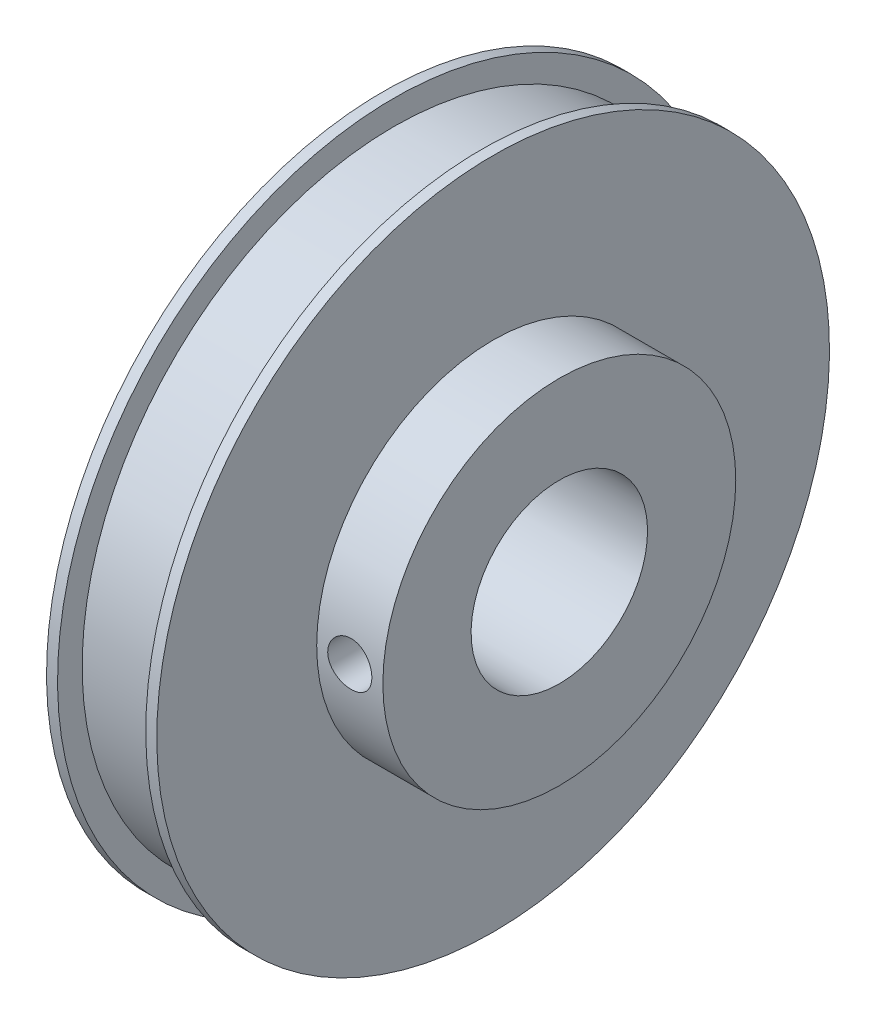
ISO-10303-21;
HEADER;
FILE_DESCRIPTION(('STEP AP214'),'2;1');
FILE_NAME('part.step','',(''),(''),'','','');
FILE_SCHEMA(('AUTOMOTIVE_DESIGN { 1 0 10303 214 1 1 1 1 }'));
ENDSEC;
DATA;
#1=APPLICATION_CONTEXT('core data for automotive mechanical design processes');
#2=APPLICATION_PROTOCOL_DEFINITION('international standard','automotive_design',2000,#1);
#3=PRODUCT_CONTEXT('',#1,'mechanical');
#4=PRODUCT('Part','Part','',(#3));
#5=PRODUCT_RELATED_PRODUCT_CATEGORY('part','',(#4));
#6=PRODUCT_DEFINITION_FORMATION('','',#4);
#7=PRODUCT_DEFINITION_CONTEXT('part definition',#1,'design');
#8=PRODUCT_DEFINITION('design','',#6,#7);
#9=PRODUCT_DEFINITION_SHAPE('','',#8);
#10=(LENGTH_UNIT() NAMED_UNIT(*) SI_UNIT(.MILLI.,.METRE.));
#11=(NAMED_UNIT(*) PLANE_ANGLE_UNIT() SI_UNIT($,.RADIAN.));
#12=(NAMED_UNIT(*) SI_UNIT($,.STERADIAN.) SOLID_ANGLE_UNIT());
#13=UNCERTAINTY_MEASURE_WITH_UNIT(LENGTH_MEASURE(1.E-05),#10,'distance_accuracy_value','');
#14=(GEOMETRIC_REPRESENTATION_CONTEXT(3) GLOBAL_UNCERTAINTY_ASSIGNED_CONTEXT((#13)) GLOBAL_UNIT_ASSIGNED_CONTEXT((#10,
#11,#12)) REPRESENTATION_CONTEXT('',''));
#15=CARTESIAN_POINT('',(0.,0.,0.));
#16=DIRECTION('',(0.,0.,1.));
#17=DIRECTION('',(1.,0.,0.));
#18=AXIS2_PLACEMENT_3D('',#15,#16,#17);
#19=CARTESIAN_POINT('',(10.0213,30.5213,30.5213));
#20=DIRECTION('',(-1.,0.,0.));
#21=DIRECTION('',(0.,-1.,0.));
#22=AXIS2_PLACEMENT_3D('',#19,#20,#21);
#23=PLANE('',#22);
#24=CARTESIAN_POINT('',(10.0213,30.5213,30.5213));
#25=DIRECTION('',(-1.,0.,0.));
#26=DIRECTION('',(0.,-1.,0.));
#27=AXIS2_PLACEMENT_3D('',#24,#25,#26);
#28=CIRCLE('',#27,16.);
#29=CARTESIAN_POINT('',(10.0213,14.5213,30.5213));
#30=VERTEX_POINT('',#29);
#31=EDGE_CURVE('E16',#30,#30,#28,.F.);
#32=ORIENTED_EDGE('',*,*,#31,.F.);
#33=EDGE_LOOP('',(#32));
#34=FACE_BOUND('',#33,.T.);
#35=CARTESIAN_POINT('',(10.0213,30.5213,30.5213));
#36=DIRECTION('',(-1.,0.,0.));
#37=DIRECTION('',(0.,-1.,0.));
#38=AXIS2_PLACEMENT_3D('',#35,#36,#37);
#39=CIRCLE('',#38,30.5);
#40=CARTESIAN_POINT('',(10.0213,0.0213000000000019,30.5213));
#41=VERTEX_POINT('',#40);
#42=EDGE_CURVE('E175',#41,#41,#39,.T.);
#43=ORIENTED_EDGE('',*,*,#42,.F.);
#44=EDGE_LOOP('',(#43));
#45=FACE_BOUND('',#44,.T.);
#46=ADVANCED_FACE('F13',(#34,#45),#23,.F.);
#47=CARTESIAN_POINT('',(16.0213,30.5213,30.5213));
#48=DIRECTION('',(-1.,0.,0.));
#49=DIRECTION('',(0.,-1.,0.));
#50=AXIS2_PLACEMENT_3D('',#47,#48,#49);
#51=CYLINDRICAL_SURFACE('',#50,16.);
#52=ORIENTED_EDGE('',*,*,#31,.T.);
#53=EDGE_LOOP('',(#52));
#54=FACE_BOUND('',#53,.T.);
#55=CARTESIAN_POINT('',(11.0213,30.5213,46.5213));
#56=CARTESIAN_POINT('',(11.0213049235413,30.6330705516784,46.5212984354949));
#57=CARTESIAN_POINT('',(11.0307085030814,30.7449875068559,46.520115527204));
#58=CARTESIAN_POINT('',(11.0680931473375,30.9657851639168,46.5155078603868));
#59=CARTESIAN_POINT('',(11.0961128346649,31.0746590620162,46.5120784412599));
#60=CARTESIAN_POINT('',(11.1698946479489,31.2860262880671,46.5033639570278));
#61=CARTESIAN_POINT('',(11.2156378087264,31.3885263008594,46.4980808760206));
#62=CARTESIAN_POINT('',(11.323529023355,31.5843472643249,46.4862480056668));
#63=CARTESIAN_POINT('',(11.3856702558448,31.6776720096713,46.4796987433355));
#64=CARTESIAN_POINT('',(11.5249718097337,31.8530678169652,46.4660227421944));
#65=CARTESIAN_POINT('',(11.6022058426999,31.9350801337535,46.4588932737014));
#66=CARTESIAN_POINT('',(11.7693457746991,32.0850189070609,46.4448821515767));
#67=CARTESIAN_POINT('',(11.859252949172,32.152943944117,46.4380005229754));
#68=CARTESIAN_POINT('',(12.04955640196,32.2729883778861,46.4252384167347));
#69=CARTESIAN_POINT('',(12.1499867701255,32.3250541286476,46.4193613659788));
#70=CARTESIAN_POINT('',(12.3582505852875,32.4115587672439,46.4093089909994));
#71=CARTESIAN_POINT('',(12.4660836866777,32.4459984773393,46.4051335873952));
#72=CARTESIAN_POINT('',(12.6854952604978,32.496099161047,46.3989827195461));
#73=CARTESIAN_POINT('',(12.7970512111634,32.5118573446681,46.3969958709405));
#74=CARTESIAN_POINT('',(13.0212408145873,32.5244484447913,46.3954122244896));
#75=CARTESIAN_POINT('',(13.133874425714,32.5212820894527,46.3958153346858));
#76=CARTESIAN_POINT('',(13.3563433727277,32.4961938465276,46.3989556360191));
#77=CARTESIAN_POINT('',(13.466191018874,32.4743792112769,46.4016794795647));
#78=CARTESIAN_POINT('',(13.6806550909836,32.412780650256,46.409133556212));
#79=CARTESIAN_POINT('',(13.7852713647753,32.3729962021122,46.4138638476399));
#80=CARTESIAN_POINT('',(13.9866384815753,32.2764705206832,46.4248131493164));
#81=CARTESIAN_POINT('',(14.0833664774452,32.2196821129028,46.4310362915393));
#82=CARTESIAN_POINT('',(14.2659523414246,32.0907992023611,46.4442662599109));
#83=CARTESIAN_POINT('',(14.3518105915254,32.0187052377157,46.4512730585034));
#84=CARTESIAN_POINT('',(14.510835983388,31.8606777794097,46.4653392746497));
#85=CARTESIAN_POINT('',(14.5839138819665,31.7746544638048,46.4723987291416));
#86=CARTESIAN_POINT('',(14.7146408785743,31.5914684210836,46.4857341880532));
#87=CARTESIAN_POINT('',(14.7722829127205,31.4943006228932,46.4920098330812));
#88=CARTESIAN_POINT('',(14.8704958920174,31.2914897311272,46.5030750061463));
#89=CARTESIAN_POINT('',(14.9110471363417,31.1858370228995,46.5078628174736));
#90=CARTESIAN_POINT('',(14.9737241824602,30.9692914963711,46.5153919682264));
#91=CARTESIAN_POINT('',(14.9958889897237,30.8584103011513,46.5181376386162));
#92=CARTESIAN_POINT('',(15.0128120286625,30.7091910695471,46.5202409685312));
#93=CARTESIAN_POINT('',(15.0159926107646,30.6716890808653,46.5206372997389));
#94=CARTESIAN_POINT('',(15.020237425861,30.5965635959675,46.5211670789556));
#95=CARTESIAN_POINT('',(15.0213016580627,30.558940099706,46.5213005268662));
#96=CARTESIAN_POINT('',(15.0212950764587,30.4095294483216,46.5212984354949));
#97=CARTESIAN_POINT('',(15.0118914969186,30.2976124931441,46.520115527204));
#98=CARTESIAN_POINT('',(14.9745068526625,30.0768148360832,46.5155078603868));
#99=CARTESIAN_POINT('',(14.946487165335,29.9679409379838,46.5120784412599));
#100=CARTESIAN_POINT('',(14.8727053520511,29.7565737119329,46.5033639570278));
#101=CARTESIAN_POINT('',(14.8269621912736,29.6540736991406,46.4980808760206));
#102=CARTESIAN_POINT('',(14.719070976645,29.4582527356751,46.4862480056668));
#103=CARTESIAN_POINT('',(14.6569297441552,29.3649279903287,46.4796987433355));
#104=CARTESIAN_POINT('',(14.5176281902663,29.1895321830348,46.4660227421944));
#105=CARTESIAN_POINT('',(14.4403941573001,29.1075198662465,46.4588932737014));
#106=CARTESIAN_POINT('',(14.2732542253009,28.9575810929391,46.4448821515767));
#107=CARTESIAN_POINT('',(14.183347050828,28.889656055883,46.4380005229754));
#108=CARTESIAN_POINT('',(13.99304359804,28.7696116221139,46.4252384167347));
#109=CARTESIAN_POINT('',(13.8926132298745,28.7175458713524,46.4193613659788));
#110=CARTESIAN_POINT('',(13.6843494147125,28.6310412327561,46.4093089909994));
#111=CARTESIAN_POINT('',(13.5765163133223,28.5966015226607,46.4051335873952));
#112=CARTESIAN_POINT('',(13.3571047395022,28.546500838953,46.3989827195461));
#113=CARTESIAN_POINT('',(13.2455487888366,28.530742655332,46.3969958709405));
#114=CARTESIAN_POINT('',(13.0213591854127,28.5181515552087,46.3954122244896));
#115=CARTESIAN_POINT('',(12.908725574286,28.5213179105473,46.3958153346858));
#116=CARTESIAN_POINT('',(12.6862566272723,28.5464061534724,46.3989556360191));
#117=CARTESIAN_POINT('',(12.576408981126,28.5682207887232,46.4016794795647));
#118=CARTESIAN_POINT('',(12.3619449090164,28.629819349744,46.409133556212));
#119=CARTESIAN_POINT('',(12.2573286352247,28.6696037978878,46.4138638476399));
#120=CARTESIAN_POINT('',(12.0559615184247,28.7661294793168,46.4248131493164));
#121=CARTESIAN_POINT('',(11.9592335225548,28.8229178870972,46.4310362915393));
#122=CARTESIAN_POINT('',(11.7766476585754,28.9518007976389,46.4442662599109));
#123=CARTESIAN_POINT('',(11.6907894084746,29.0238947622843,46.4512730585034));
#124=CARTESIAN_POINT('',(11.531764016612,29.1819222205903,46.4653392746497));
#125=CARTESIAN_POINT('',(11.4586861180335,29.2679455361952,46.4723987291416));
#126=CARTESIAN_POINT('',(11.3279591214257,29.4511315789164,46.4857341880532));
#127=CARTESIAN_POINT('',(11.2703170872795,29.5482993771068,46.4920098330812));
#128=CARTESIAN_POINT('',(11.1721041079825,29.7511102688728,46.5030750061463));
#129=CARTESIAN_POINT('',(11.1315528636582,29.8567629771005,46.5078628174736));
#130=CARTESIAN_POINT('',(11.0688758175398,30.0733085036289,46.5153919682264));
#131=CARTESIAN_POINT('',(11.0467110102763,30.1841896988487,46.5181376386162));
#132=CARTESIAN_POINT('',(11.0297879713375,30.3334089304529,46.5202409685312));
#133=CARTESIAN_POINT('',(11.0266073892354,30.3709109191347,46.5206372997389));
#134=CARTESIAN_POINT('',(11.022362574139,30.4460364040325,46.5211670789556));
#135=CARTESIAN_POINT('',(11.0212983419373,30.483659900294,46.5213005268662));
#136=CARTESIAN_POINT('',(11.0213,30.5213,46.5213));
#137=B_SPLINE_CURVE_WITH_KNOTS('',3,(#55,#56,#57,#58,#59,#60,#61,#62,#63,#64,#65,#66,#67,#68,
#69,#70,#71,#72,#73,#74,#75,#76,#77,#78,#79,#80,#81,#82,#83,#84,#85,#86,#87,#88,#89,#90,#91,#92,
#93,#94,#95,#96,#97,#98,#99,#100,#101,#102,#103,#104,#105,#106,#107,#108,#109,#110,#111,#112,
#113,#114,#115,#116,#117,#118,#119,#120,#121,#122,#123,#124,#125,#126,#127,#128,#129,#130,#131,
#132,#133,#134,#135,#136),.UNSPECIFIED.,.T.,.F.,(4,2,2,2,2,2,2,2,2,2,2,2,2,2,2,2,2,2,2,2,2,2,2,
2,2,2,2,2,2,2,2,2,2,2,2,2,2,2,2,2,4),(0.,0.335168209437112,0.671033968778323,1.00654131979086,
1.34190932399502,1.67895812019291,2.01604086162986,2.35425147796851,2.69244631523192,
3.02887350909363,3.36528775833332,3.69978009739516,4.03428216061067,4.36972097765979,
4.705148003235,5.04283107805394,5.38066842302405,5.71889414038631,6.0564004884839,
6.16927243828347,6.28214443034274,6.61731263977985,6.95317839912107,7.2886857501336,
7.62405375433776,7.96110255053565,8.2981852919726,8.63639590831125,8.97459074557466,
9.31101793943637,9.64743218867605,9.9819245277379,10.3164265909534,10.6518654080025,
10.9872924335777,11.3249755083967,11.6628128533668,12.0010385707291,12.3385449188266,
12.4514168686262,12.5642888606855),.UNSPECIFIED.);
#138=CARTESIAN_POINT('',(11.0213,30.5213,46.5213));
#139=VERTEX_POINT('',#138);
#140=EDGE_CURVE('E178',#139,#139,#137,.T.);
#141=ORIENTED_EDGE('',*,*,#140,.T.);
#142=EDGE_LOOP('',(#141));
#143=FACE_BOUND('',#142,.T.);
#144=CARTESIAN_POINT('',(16.0213,30.5213,30.5213));
#145=DIRECTION('',(-1.,0.,0.));
#146=DIRECTION('',(0.,-1.,0.));
#147=AXIS2_PLACEMENT_3D('',#144,#145,#146);
#148=CIRCLE('',#147,16.);
#149=CARTESIAN_POINT('',(16.0213,14.5213,30.5213));
#150=VERTEX_POINT('',#149);
#151=EDGE_CURVE('E176',#150,#150,#148,.T.);
#152=ORIENTED_EDGE('',*,*,#151,.T.);
#153=EDGE_LOOP('',(#152));
#154=FACE_BOUND('',#153,.T.);
#155=ADVANCED_FACE('F148',(#54,#143,#154),#51,.T.);
#156=CARTESIAN_POINT('',(10.0213,30.5213,30.5213));
#157=DIRECTION('',(-1.,0.,0.));
#158=DIRECTION('',(0.,-1.,0.));
#159=AXIS2_PLACEMENT_3D('',#156,#157,#158);
#160=CYLINDRICAL_SURFACE('',#159,30.5);
#161=ORIENTED_EDGE('',*,*,#42,.T.);
#162=EDGE_LOOP('',(#161));
#163=FACE_BOUND('',#162,.T.);
#164=CARTESIAN_POINT('',(9.0213,30.5213,30.5213));
#165=DIRECTION('',(-1.,0.,0.));
#166=DIRECTION('',(0.,-1.,0.));
#167=AXIS2_PLACEMENT_3D('',#164,#165,#166);
#168=CIRCLE('',#167,30.5);
#169=CARTESIAN_POINT('',(9.0213,0.0213000000000019,30.5213));
#170=VERTEX_POINT('',#169);
#171=EDGE_CURVE('E185',#170,#170,#168,.T.);
#172=ORIENTED_EDGE('',*,*,#171,.F.);
#173=EDGE_LOOP('',(#172));
#174=FACE_BOUND('',#173,.T.);
#175=ADVANCED_FACE('F140',(#163,#174),#160,.T.);
#176=CARTESIAN_POINT('',(16.0213,30.5213,30.5213));
#177=DIRECTION('',(-1.,0.,0.));
#178=DIRECTION('',(0.,-1.,0.));
#179=AXIS2_PLACEMENT_3D('',#176,#177,#178);
#180=PLANE('',#179);
#181=CARTESIAN_POINT('',(16.0213,30.5213,30.5213));
#182=DIRECTION('',(-1.,0.,0.));
#183=DIRECTION('',(0.,-1.,0.));
#184=AXIS2_PLACEMENT_3D('',#181,#182,#183);
#185=CIRCLE('',#184,8.);
#186=CARTESIAN_POINT('',(16.0213,22.5213,30.5213));
#187=VERTEX_POINT('',#186);
#188=EDGE_CURVE('E44',#187,#187,#185,.T.);
#189=ORIENTED_EDGE('',*,*,#188,.T.);
#190=EDGE_LOOP('',(#189));
#191=FACE_BOUND('',#190,.T.);
#192=ORIENTED_EDGE('',*,*,#151,.F.);
#193=EDGE_LOOP('',(#192));
#194=FACE_BOUND('',#193,.T.);
#195=ADVANCED_FACE('F64',(#191,#194),#180,.F.);
#196=CARTESIAN_POINT('',(13.0213,30.5213,46.5213));
#197=DIRECTION('',(0.,0.,-1.));
#198=DIRECTION('',(0.,1.,0.));
#199=AXIS2_PLACEMENT_3D('',#196,#197,#198);
#200=CYLINDRICAL_SURFACE('',#199,2.);
#201=ORIENTED_EDGE('',*,*,#140,.F.);
#202=EDGE_LOOP('',(#201));
#203=FACE_BOUND('',#202,.T.);
#204=CARTESIAN_POINT('',(15.0213,30.5213,38.5213));
#205=CARTESIAN_POINT('',(15.0212968990158,30.4107985484404,38.5212981315735));
#206=CARTESIAN_POINT('',(15.0121112656349,30.3002624562256,38.5189877084244));
#207=CARTESIAN_POINT('',(14.975666464924,30.0823582349726,38.5099948510653));
#208=CARTESIAN_POINT('',(14.9483970539495,29.9749919375057,38.503309938933));
#209=CARTESIAN_POINT('',(14.8767143287172,29.7666055037566,38.4863083510938));
#210=CARTESIAN_POINT('',(14.832321601713,29.6655779154267,38.4759960378941));
#211=CARTESIAN_POINT('',(14.7277248132735,29.4724038241274,38.4528379174349));
#212=CARTESIAN_POINT('',(14.667520218508,29.3802576208683,38.4399920247221));
#213=CARTESIAN_POINT('',(14.5316989471278,29.2055640969321,38.4128655145559));
#214=CARTESIAN_POINT('',(14.4558179000546,29.1232257465853,38.398562761975));
#215=CARTESIAN_POINT('',(14.291363726788,28.9723014303956,38.3702816015725));
#216=CARTESIAN_POINT('',(14.2027891694041,28.9037170174011,38.3563032305316));
#217=CARTESIAN_POINT('',(14.013839697684,28.7812646096014,38.3300303426422));
#218=CARTESIAN_POINT('',(13.9133090255884,28.7276303787665,38.3177639261975));
#219=CARTESIAN_POINT('',(13.7043021177866,28.6381041219323,38.2966265975735));
#220=CARTESIAN_POINT('',(13.5958271555573,28.6022092594131,38.2877551425922));
#221=CARTESIAN_POINT('',(13.3763086690645,28.549893550927,38.2746396892843));
#222=CARTESIAN_POINT('',(13.265360138616,28.5330969755573,38.2703065466268));
#223=CARTESIAN_POINT('',(13.0421419080009,28.5182842999115,38.2664914994612));
#224=CARTESIAN_POINT('',(12.9298724257438,28.5202651442425,38.2670088057057));
#225=CARTESIAN_POINT('',(12.7100789230062,28.5426513004804,38.2727560735576));
#226=CARTESIAN_POINT('',(12.6025058380462,28.5626088797458,38.2778715067639));
#227=CARTESIAN_POINT('',(12.3922852654519,28.619667750796,38.2920561289476));
#228=CARTESIAN_POINT('',(12.2896381292948,28.6567702639075,38.3011255995898));
#229=CARTESIAN_POINT('',(12.0909826449972,28.7474473627504,38.3223015187421));
#230=CARTESIAN_POINT('',(11.9950517709472,28.8011844436894,38.3344376995975));
#231=CARTESIAN_POINT('',(11.8134083869909,28.9234916319801,38.3603628112799));
#232=CARTESIAN_POINT('',(11.7276976692437,28.9920643349216,38.3741520311284));
#233=CARTESIAN_POINT('',(11.5663618457408,29.1444154337584,38.4023117405319));
#234=CARTESIAN_POINT('',(11.4910940132515,29.2285716557789,38.41668759304));
#235=CARTESIAN_POINT('',(11.3556716767148,29.4084841099951,38.4440462077168));
#236=CARTESIAN_POINT('',(11.2955176343152,29.5042406963894,38.4570289273254));
#237=CARTESIAN_POINT('',(11.1918992183675,29.7051454817581,38.4802030945892));
#238=CARTESIAN_POINT('',(11.1484928796608,29.8103248090552,38.490384801703));
#239=CARTESIAN_POINT('',(11.0800769257206,30.0267986558095,38.5067388932189));
#240=CARTESIAN_POINT('',(11.0550637914425,30.1380920011327,38.5129120445237));
#241=CARTESIAN_POINT('',(11.0246899125882,30.36058003948,38.520439990285));
#242=CARTESIAN_POINT('',(11.0188426318996,30.4717043733491,38.521914046777));
#243=CARTESIAN_POINT('',(11.0256320027406,30.6933438330687,38.520217397526));
#244=CARTESIAN_POINT('',(11.0382669903988,30.8038590128595,38.5170471098913));
#245=CARTESIAN_POINT('',(11.0812612111885,31.0194523583687,38.5064944150314));
#246=CARTESIAN_POINT('',(11.1113550179693,31.1245868252917,38.4991751224775));
#247=CARTESIAN_POINT('',(11.1881094453713,31.32830972327,38.4811494217885));
#248=CARTESIAN_POINT('',(11.2347717390842,31.4268974920435,38.4704426715986));
#249=CARTESIAN_POINT('',(11.3442815051663,31.6166641792398,38.4465441056841));
#250=CARTESIAN_POINT('',(11.4074014831957,31.7076805891144,38.4333115648924));
#251=CARTESIAN_POINT('',(11.5476865450626,31.8780021515243,38.4058934558323));
#252=CARTESIAN_POINT('',(11.6248540528225,31.9573052786307,38.3917077233561));
#253=CARTESIAN_POINT('',(11.7933026144593,32.1039540907636,38.3635527594769));
#254=CARTESIAN_POINT('',(11.8848836040032,32.1709584901627,38.3495973891637));
#255=CARTESIAN_POINT('',(12.0782768459543,32.2886476786836,38.3238717116965));
#256=CARTESIAN_POINT('',(12.1800886439463,32.3393331922106,38.3121013075604));
#257=CARTESIAN_POINT('',(12.3905076298841,32.4225685608124,38.2922079297955));
#258=CARTESIAN_POINT('',(12.4990701711253,32.4552258622054,38.2840634038921));
#259=CARTESIAN_POINT('',(12.7203795171855,32.5017608799384,38.2723232545358));
#260=CARTESIAN_POINT('',(12.8331254013767,32.5156427033049,38.2687266362658));
#261=CARTESIAN_POINT('',(13.0561280318069,32.5240181204453,38.2665653493861));
#262=CARTESIAN_POINT('',(13.166363246833,32.5190571970402,38.2678591030435));
#263=CARTESIAN_POINT('',(13.3843718515573,32.4911363710838,38.2750054534379));
#264=CARTESIAN_POINT('',(13.4921452906849,32.468176830249,38.2808579585581));
#265=CARTESIAN_POINT('',(13.7015779454205,32.4052084259237,38.2963834757696));
#266=CARTESIAN_POINT('',(13.8032697403203,32.3653018729072,38.3060335364841));
#267=CARTESIAN_POINT('',(13.9985871769516,32.2696532181401,38.3280700763311));
#268=CARTESIAN_POINT('',(14.0922116975826,32.2139089200456,38.3404569349436));
#269=CARTESIAN_POINT('',(14.2713728386694,32.0864569981829,38.3669751235135));
#270=CARTESIAN_POINT('',(14.3566347645653,32.014370883883,38.3811435310901));
#271=CARTESIAN_POINT('',(14.5140293930605,31.8570191615863,38.4094070299505));
#272=CARTESIAN_POINT('',(14.586158973484,31.7717504283482,38.4235021030275));
#273=CARTESIAN_POINT('',(14.7165150780861,31.5885901156035,38.4503354086355));
#274=CARTESIAN_POINT('',(14.7744661515621,31.4904978964219,38.4630444448782));
#275=CARTESIAN_POINT('',(14.8729632839207,31.285654746014,38.4853656663349));
#276=CARTESIAN_POINT('',(14.913521814198,31.1789100845823,38.4949800693304));
#277=CARTESIAN_POINT('',(14.9700624404395,30.9805136709913,38.5086074608739));
#278=CARTESIAN_POINT('',(14.9892349907379,30.8898068945441,38.5133344673692));
#279=CARTESIAN_POINT('',(15.0148545914959,30.7065080953817,38.5196814030926));
#280=CARTESIAN_POINT('',(15.0213025990737,30.6139162149902,38.5213015660119));
#281=CARTESIAN_POINT('',(15.0213,30.5213,38.5213));
#282=B_SPLINE_CURVE_WITH_KNOTS('',3,(#204,#205,#206,#207,#208,#209,#210,#211,#212,#213,#214,
#215,#216,#217,#218,#219,#220,#221,#222,#223,#224,#225,#226,#227,#228,#229,#230,#231,#232,#233,
#234,#235,#236,#237,#238,#239,#240,#241,#242,#243,#244,#245,#246,#247,#248,#249,#250,#251,#252,
#253,#254,#255,#256,#257,#258,#259,#260,#261,#262,#263,#264,#265,#266,#267,#268,#269,#270,#271,
#272,#273,#274,#275,#276,#277,#278,#279,#280,#281),.UNSPECIFIED.,.T.,.F.,(4,2,2,2,2,2,2,2,2,2,2,
2,2,2,2,2,2,2,2,2,2,2,2,2,2,2,2,2,2,2,2,2,2,2,2,2,2,2,4),(0.,0.33116494996252,0.662517650351865,
0.993473203048146,1.32443992022577,1.66152580582852,1.99864972773416,2.34078196727742,
2.68285948225824,3.01808393468093,3.3532538415469,3.68029996013785,4.00736937959145,
4.337740371696,4.66816921119311,5.00802001296453,5.34788119415423,5.68890972016579,
6.02987298255951,6.36211078603462,6.69431868154751,7.02160366023145,7.34892169767482,
7.68204783424896,8.01523150681786,8.35659345610395,8.69794025003771,9.03723006156476,
9.37644564340971,9.70591707202577,10.0353818794581,10.3628853408369,10.6904342418696,
11.0265276855097,11.3627009303165,11.7049624733721,12.0469781843289,12.3245632392729,
12.6021274139515),.UNSPECIFIED.);
#283=CARTESIAN_POINT('',(15.0213,30.5213,38.5213));
#284=VERTEX_POINT('',#283);
#285=EDGE_CURVE('E36',#284,#284,#282,.T.);
#286=ORIENTED_EDGE('',*,*,#285,.T.);
#287=EDGE_LOOP('',(#286));
#288=FACE_BOUND('',#287,.T.);
#289=ADVANCED_FACE('F46',(#203,#288),#200,.F.);
#290=CARTESIAN_POINT('',(9.0213,30.5213,30.5213));
#291=DIRECTION('',(-1.,0.,0.));
#292=DIRECTION('',(0.,-1.,0.));
#293=AXIS2_PLACEMENT_3D('',#290,#291,#292);
#294=PLANE('',#293);
#295=CARTESIAN_POINT('',(9.0213,30.5213,30.5213));
#296=DIRECTION('',(-1.,0.,0.));
#297=DIRECTION('',(0.,-1.,0.));
#298=AXIS2_PLACEMENT_3D('',#295,#296,#297);
#299=CIRCLE('',#298,28.266889756541);
#300=CARTESIAN_POINT('',(9.0213,2.254410243459,30.5213));
#301=VERTEX_POINT('',#300);
#302=EDGE_CURVE('E33',#301,#301,#299,.T.);
#303=ORIENTED_EDGE('',*,*,#302,.F.);
#304=EDGE_LOOP('',(#303));
#305=FACE_BOUND('',#304,.T.);
#306=ORIENTED_EDGE('',*,*,#171,.T.);
#307=EDGE_LOOP('',(#306));
#308=FACE_BOUND('',#307,.T.);
#309=ADVANCED_FACE('F54',(#305,#308),#294,.T.);
#310=CARTESIAN_POINT('',(9.0213,30.5213,30.5213));
#311=DIRECTION('',(-1.,0.,0.));
#312=DIRECTION('',(0.,-1.,0.));
#313=AXIS2_PLACEMENT_3D('',#310,#311,#312);
#314=CYLINDRICAL_SURFACE('',#313,28.266889756541);
#315=ORIENTED_EDGE('',*,*,#302,.T.);
#316=EDGE_LOOP('',(#315));
#317=FACE_BOUND('',#316,.T.);
#318=CARTESIAN_POINT('',(1.0213,30.5213,30.5213));
#319=DIRECTION('',(-1.,0.,0.));
#320=DIRECTION('',(0.,-1.,0.));
#321=AXIS2_PLACEMENT_3D('',#318,#319,#320);
#322=CIRCLE('',#321,28.266889756541);
#323=CARTESIAN_POINT('',(1.0213,2.254410243459,30.5213));
#324=VERTEX_POINT('',#323);
#325=EDGE_CURVE('E30',#324,#324,#322,.F.);
#326=ORIENTED_EDGE('',*,*,#325,.T.);
#327=EDGE_LOOP('',(#326));
#328=FACE_BOUND('',#327,.T.);
#329=ADVANCED_FACE('F52',(#317,#328),#314,.T.);
#330=CARTESIAN_POINT('',(1.0213,30.5213,30.5213));
#331=DIRECTION('',(-1.,0.,0.));
#332=DIRECTION('',(0.,-1.,0.));
#333=AXIS2_PLACEMENT_3D('',#330,#331,#332);
#334=PLANE('',#333);
#335=ORIENTED_EDGE('',*,*,#325,.F.);
#336=EDGE_LOOP('',(#335));
#337=FACE_BOUND('',#336,.T.);
#338=CARTESIAN_POINT('',(1.0213,30.5213,30.5213));
#339=DIRECTION('',(-1.,0.,0.));
#340=DIRECTION('',(0.,-1.,0.));
#341=AXIS2_PLACEMENT_3D('',#338,#339,#340);
#342=CIRCLE('',#341,30.5);
#343=CARTESIAN_POINT('',(1.0213,0.0213000000000019,30.5213));
#344=VERTEX_POINT('',#343);
#345=EDGE_CURVE('E25',#344,#344,#342,.T.);
#346=ORIENTED_EDGE('',*,*,#345,.F.);
#347=EDGE_LOOP('',(#346));
#348=FACE_BOUND('',#347,.T.);
#349=ADVANCED_FACE('F62',(#337,#348),#334,.F.);
#350=CARTESIAN_POINT('',(1.0213,30.5213,30.5213));
#351=DIRECTION('',(-1.,0.,0.));
#352=DIRECTION('',(0.,-1.,0.));
#353=AXIS2_PLACEMENT_3D('',#350,#351,#352);
#354=CYLINDRICAL_SURFACE('',#353,30.5);
#355=ORIENTED_EDGE('',*,*,#345,.T.);
#356=EDGE_LOOP('',(#355));
#357=FACE_BOUND('',#356,.T.);
#358=CARTESIAN_POINT('',(0.0212999999999965,30.5213,30.5213));
#359=DIRECTION('',(-1.,0.,0.));
#360=DIRECTION('',(0.,-1.,0.));
#361=AXIS2_PLACEMENT_3D('',#358,#359,#360);
#362=CIRCLE('',#361,30.5);
#363=CARTESIAN_POINT('',(0.0212999999999998,0.0213000000000019,30.5213));
#364=VERTEX_POINT('',#363);
#365=EDGE_CURVE('E20',#364,#364,#362,.T.);
#366=ORIENTED_EDGE('',*,*,#365,.F.);
#367=EDGE_LOOP('',(#366));
#368=FACE_BOUND('',#367,.T.);
#369=ADVANCED_FACE('F75',(#357,#368),#354,.T.);
#370=CARTESIAN_POINT('',(1.0213,30.5213,30.5213));
#371=DIRECTION('',(-1.,0.,0.));
#372=DIRECTION('',(0.,-1.,0.));
#373=AXIS2_PLACEMENT_3D('',#370,#371,#372);
#374=CYLINDRICAL_SURFACE('',#373,8.);
#375=ORIENTED_EDGE('',*,*,#188,.F.);
#376=EDGE_LOOP('',(#375));
#377=FACE_BOUND('',#376,.T.);
#378=CARTESIAN_POINT('',(0.0212999999999991,30.5213,30.5213));
#379=DIRECTION('',(-1.,0.,0.));
#380=DIRECTION('',(0.,-1.,0.));
#381=AXIS2_PLACEMENT_3D('',#378,#379,#380);
#382=CIRCLE('',#381,8.);
#383=CARTESIAN_POINT('',(0.0212999999999999,22.5213,30.5213));
#384=VERTEX_POINT('',#383);
#385=EDGE_CURVE('E8',#384,#384,#382,.F.);
#386=ORIENTED_EDGE('',*,*,#385,.F.);
#387=EDGE_LOOP('',(#386));
#388=FACE_BOUND('',#387,.T.);
#389=ORIENTED_EDGE('',*,*,#285,.F.);
#390=EDGE_LOOP('',(#389));
#391=FACE_BOUND('',#390,.T.);
#392=ADVANCED_FACE('F70',(#377,#388,#391),#374,.F.);
#393=CARTESIAN_POINT('',(0.0213,30.5213,30.5213));
#394=DIRECTION('',(-1.,0.,0.));
#395=DIRECTION('',(0.,-1.,0.));
#396=AXIS2_PLACEMENT_3D('',#393,#394,#395);
#397=PLANE('',#396);
#398=ORIENTED_EDGE('',*,*,#385,.T.);
#399=EDGE_LOOP('',(#398));
#400=FACE_BOUND('',#399,.T.);
#401=ORIENTED_EDGE('',*,*,#365,.T.);
#402=EDGE_LOOP('',(#401));
#403=FACE_BOUND('',#402,.T.);
#404=ADVANCED_FACE('F68',(#400,#403),#397,.T.);
#405=CLOSED_SHELL('',(#46,#155,#175,#195,#289,#309,#329,#349,#369,#392,#404));
#406=MANIFOLD_SOLID_BREP('B1',#405);
#407=ADVANCED_BREP_SHAPE_REPRESENTATION('',(#18,#406),#14);
#408=SHAPE_DEFINITION_REPRESENTATION(#9,#407);
ENDSEC;
END-ISO-10303-21;
